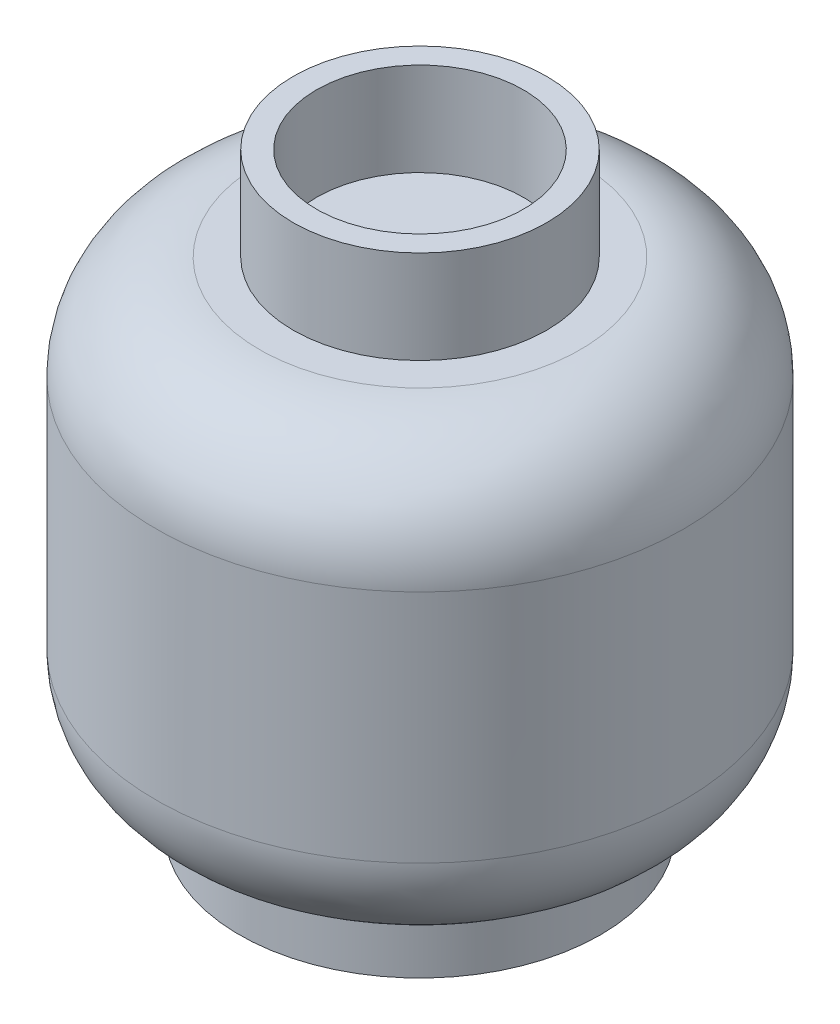
ISO-10303-21;
HEADER;
FILE_DESCRIPTION(('STEP AP214'),'2;1');
FILE_NAME('part.step','',(''),(''),'','','');
FILE_SCHEMA(('AUTOMOTIVE_DESIGN { 1 0 10303 214 1 1 1 1 }'));
ENDSEC;
DATA;
#1=APPLICATION_CONTEXT('core data for automotive mechanical design processes');
#2=APPLICATION_PROTOCOL_DEFINITION('international standard','automotive_design',2000,#1);
#3=PRODUCT_CONTEXT('',#1,'mechanical');
#4=PRODUCT('Part','Part','',(#3));
#5=PRODUCT_RELATED_PRODUCT_CATEGORY('part','',(#4));
#6=PRODUCT_DEFINITION_FORMATION('','',#4);
#7=PRODUCT_DEFINITION_CONTEXT('part definition',#1,'design');
#8=PRODUCT_DEFINITION('design','',#6,#7);
#9=PRODUCT_DEFINITION_SHAPE('','',#8);
#10=(LENGTH_UNIT() NAMED_UNIT(*) SI_UNIT(.MILLI.,.METRE.));
#11=(NAMED_UNIT(*) PLANE_ANGLE_UNIT() SI_UNIT($,.RADIAN.));
#12=(NAMED_UNIT(*) SI_UNIT($,.STERADIAN.) SOLID_ANGLE_UNIT());
#13=UNCERTAINTY_MEASURE_WITH_UNIT(LENGTH_MEASURE(1.E-05),#10,'distance_accuracy_value','');
#14=(GEOMETRIC_REPRESENTATION_CONTEXT(3) GLOBAL_UNCERTAINTY_ASSIGNED_CONTEXT((#13)) GLOBAL_UNIT_ASSIGNED_CONTEXT((#10,
#11,#12)) REPRESENTATION_CONTEXT('',''));
#15=CARTESIAN_POINT('',(0.,0.,0.));
#16=DIRECTION('',(0.,0.,1.));
#17=DIRECTION('',(1.,0.,0.));
#18=AXIS2_PLACEMENT_3D('',#15,#16,#17);
#19=CARTESIAN_POINT('',(0.,-5.7,0.));
#20=DIRECTION('',(0.,-1.,0.));
#21=DIRECTION('',(1.,0.,0.));
#22=AXIS2_PLACEMENT_3D('',#19,#20,#21);
#23=CYLINDRICAL_SURFACE('',#22,5.1);
#24=CARTESIAN_POINT('',(0.,-2.63819496743612,0.));
#25=DIRECTION('',(0.,-1.,0.));
#26=DIRECTION('',(1.,0.,0.));
#27=AXIS2_PLACEMENT_3D('',#24,#25,#26);
#28=CIRCLE('',#27,5.1);
#29=CARTESIAN_POINT('',(5.1,-2.63819496743612,0.));
#30=VERTEX_POINT('',#29);
#31=EDGE_CURVE('E43',#30,#30,#28,.F.);
#32=ORIENTED_EDGE('',*,*,#31,.T.);
#33=EDGE_LOOP('',(#32));
#34=FACE_BOUND('',#33,.T.);
#35=CARTESIAN_POINT('',(0.,1.9,0.));
#36=DIRECTION('',(0.,1.,0.));
#37=DIRECTION('',(-1.,0.,0.));
#38=AXIS2_PLACEMENT_3D('',#35,#36,#37);
#39=CIRCLE('',#38,5.1);
#40=CARTESIAN_POINT('',(-5.1,1.9,0.));
#41=VERTEX_POINT('',#40);
#42=EDGE_CURVE('E47',#41,#41,#39,.F.);
#43=ORIENTED_EDGE('',*,*,#42,.T.);
#44=EDGE_LOOP('',(#43));
#45=FACE_BOUND('',#44,.T.);
#46=ADVANCED_FACE('F36',(#34,#45),#23,.T.);
#47=CARTESIAN_POINT('',(2.45,3.9,0.));
#48=DIRECTION('',(0.,1.,0.));
#49=DIRECTION('',(-1.,0.,0.));
#50=AXIS2_PLACEMENT_3D('',#47,#48,#49);
#51=PLANE('',#50);
#52=CARTESIAN_POINT('',(0.,3.9,0.));
#53=DIRECTION('',(0.,1.,0.));
#54=DIRECTION('',(-1.,0.,0.));
#55=AXIS2_PLACEMENT_3D('',#52,#53,#54);
#56=CIRCLE('',#55,3.1);
#57=CARTESIAN_POINT('',(-3.1,3.9,0.));
#58=VERTEX_POINT('',#57);
#59=EDGE_CURVE('E10',#58,#58,#56,.T.);
#60=ORIENTED_EDGE('',*,*,#59,.T.);
#61=EDGE_LOOP('',(#60));
#62=FACE_BOUND('',#61,.T.);
#63=CARTESIAN_POINT('',(0.,3.9,0.));
#64=DIRECTION('',(0.,-1.,0.));
#65=DIRECTION('',(1.,0.,0.));
#66=AXIS2_PLACEMENT_3D('',#63,#64,#65);
#67=CIRCLE('',#66,2.45);
#68=CARTESIAN_POINT('',(2.45,3.9,0.));
#69=VERTEX_POINT('',#68);
#70=EDGE_CURVE('E51',#69,#69,#67,.T.);
#71=ORIENTED_EDGE('',*,*,#70,.T.);
#72=EDGE_LOOP('',(#71));
#73=FACE_BOUND('',#72,.T.);
#74=ADVANCED_FACE('F97',(#62,#73),#51,.T.);
#75=CARTESIAN_POINT('',(0.,-5.7,0.));
#76=DIRECTION('',(0.,-1.,0.));
#77=DIRECTION('',(1.,0.,0.));
#78=AXIS2_PLACEMENT_3D('',#75,#76,#77);
#79=CYLINDRICAL_SURFACE('',#78,2.45);
#80=CARTESIAN_POINT('',(0.,5.7,0.));
#81=DIRECTION('',(0.,-1.,0.));
#82=DIRECTION('',(1.,0.,0.));
#83=AXIS2_PLACEMENT_3D('',#80,#81,#82);
#84=CIRCLE('',#83,2.45);
#85=CARTESIAN_POINT('',(2.45,5.7,0.));
#86=VERTEX_POINT('',#85);
#87=EDGE_CURVE('E56',#86,#86,#84,.T.);
#88=ORIENTED_EDGE('',*,*,#87,.T.);
#89=EDGE_LOOP('',(#88));
#90=FACE_BOUND('',#89,.T.);
#91=ORIENTED_EDGE('',*,*,#70,.F.);
#92=EDGE_LOOP('',(#91));
#93=FACE_BOUND('',#92,.T.);
#94=ADVANCED_FACE('F91',(#90,#93),#79,.T.);
#95=CARTESIAN_POINT('',(0.,5.7,0.));
#96=DIRECTION('',(0.,1.,0.));
#97=DIRECTION('',(-1.,0.,0.));
#98=AXIS2_PLACEMENT_3D('',#95,#96,#97);
#99=PLANE('',#98);
#100=CARTESIAN_POINT('',(0.,5.7,0.));
#101=DIRECTION('',(0.,1.,0.));
#102=DIRECTION('',(-1.,0.,0.));
#103=AXIS2_PLACEMENT_3D('',#100,#101,#102);
#104=CIRCLE('',#103,2.);
#105=CARTESIAN_POINT('',(-2.,5.7,0.));
#106=VERTEX_POINT('',#105);
#107=EDGE_CURVE('E72',#106,#106,#104,.T.);
#108=ORIENTED_EDGE('',*,*,#107,.F.);
#109=EDGE_LOOP('',(#108));
#110=FACE_BOUND('',#109,.T.);
#111=ORIENTED_EDGE('',*,*,#87,.F.);
#112=EDGE_LOOP('',(#111));
#113=FACE_BOUND('',#112,.T.);
#114=ADVANCED_FACE('F87',(#110,#113),#99,.T.);
#115=CARTESIAN_POINT('',(3.48900001826096,-5.7,0.));
#116=DIRECTION('',(0.,-1.,0.));
#117=DIRECTION('',(1.,0.,0.));
#118=AXIS2_PLACEMENT_3D('',#115,#116,#117);
#119=PLANE('',#118);
#120=CARTESIAN_POINT('',(0.,-5.7,0.));
#121=DIRECTION('',(0.,-1.,0.));
#122=DIRECTION('',(1.,0.,0.));
#123=AXIS2_PLACEMENT_3D('',#120,#121,#122);
#124=CIRCLE('',#123,2.5);
#125=CARTESIAN_POINT('',(2.5,-5.7,0.));
#126=VERTEX_POINT('',#125);
#127=EDGE_CURVE('E66',#126,#126,#124,.T.);
#128=ORIENTED_EDGE('',*,*,#127,.F.);
#129=EDGE_LOOP('',(#128));
#130=FACE_BOUND('',#129,.T.);
#131=CARTESIAN_POINT('',(0.,-5.7,0.));
#132=DIRECTION('',(0.,-1.,0.));
#133=DIRECTION('',(1.,0.,0.));
#134=AXIS2_PLACEMENT_3D('',#131,#132,#133);
#135=CIRCLE('',#134,3.48900001826096);
#136=CARTESIAN_POINT('',(3.48900001826096,-5.7,0.));
#137=VERTEX_POINT('',#136);
#138=EDGE_CURVE('E59',#137,#137,#135,.T.);
#139=ORIENTED_EDGE('',*,*,#138,.T.);
#140=EDGE_LOOP('',(#139));
#141=FACE_BOUND('',#140,.T.);
#142=ADVANCED_FACE('F90',(#130,#141),#119,.T.);
#143=CARTESIAN_POINT('',(0.,-5.7,0.));
#144=DIRECTION('',(0.,-1.,0.));
#145=DIRECTION('',(1.,0.,0.));
#146=AXIS2_PLACEMENT_3D('',#143,#144,#145);
#147=CYLINDRICAL_SURFACE('',#146,3.48900001826096);
#148=CARTESIAN_POINT('',(0.,-4.6,0.));
#149=DIRECTION('',(0.,-1.,0.));
#150=DIRECTION('',(1.,0.,0.));
#151=AXIS2_PLACEMENT_3D('',#148,#149,#150);
#152=CIRCLE('',#151,3.48900001826096);
#153=CARTESIAN_POINT('',(3.48900001826096,-4.6,0.));
#154=VERTEX_POINT('',#153);
#155=EDGE_CURVE('E62',#154,#154,#152,.T.);
#156=ORIENTED_EDGE('',*,*,#155,.T.);
#157=EDGE_LOOP('',(#156));
#158=FACE_BOUND('',#157,.T.);
#159=ORIENTED_EDGE('',*,*,#138,.F.);
#160=EDGE_LOOP('',(#159));
#161=FACE_BOUND('',#160,.T.);
#162=ADVANCED_FACE('F109',(#158,#161),#147,.T.);
#163=CARTESIAN_POINT('',(0.,-2.63819496743612,0.));
#164=DIRECTION('',(0.,-1.,0.));
#165=DIRECTION('',(1.,0.,0.));
#166=AXIS2_PLACEMENT_3D('',#163,#164,#165);
#167=TOROIDAL_SURFACE('',#166,3.1,2.);
#168=ORIENTED_EDGE('',*,*,#31,.F.);
#169=EDGE_LOOP('',(#168));
#170=FACE_BOUND('',#169,.T.);
#171=ORIENTED_EDGE('',*,*,#155,.F.);
#172=EDGE_LOOP('',(#171));
#173=FACE_BOUND('',#172,.T.);
#174=ADVANCED_FACE('F107',(#170,#173),#167,.T.);
#175=CARTESIAN_POINT('',(0.,1.9,0.));
#176=DIRECTION('',(0.,1.,0.));
#177=DIRECTION('',(-1.,0.,0.));
#178=AXIS2_PLACEMENT_3D('',#175,#176,#177);
#179=TOROIDAL_SURFACE('',#178,3.1,2.);
#180=ORIENTED_EDGE('',*,*,#59,.F.);
#181=EDGE_LOOP('',(#180));
#182=FACE_BOUND('',#181,.T.);
#183=ORIENTED_EDGE('',*,*,#42,.F.);
#184=EDGE_LOOP('',(#183));
#185=FACE_BOUND('',#184,.T.);
#186=ADVANCED_FACE('F38',(#182,#185),#179,.T.);
#187=CARTESIAN_POINT('',(0.,0.299999999999999,0.));
#188=DIRECTION('',(0.,-1.,0.));
#189=DIRECTION('',(1.,0.,0.));
#190=AXIS2_PLACEMENT_3D('',#187,#188,#189);
#191=CYLINDRICAL_SURFACE('',#190,2.5);
#192=CARTESIAN_POINT('',(0.,0.299999999999999,0.));
#193=DIRECTION('',(0.,-1.,0.));
#194=DIRECTION('',(1.,0.,0.));
#195=AXIS2_PLACEMENT_3D('',#192,#193,#194);
#196=CIRCLE('',#195,2.5);
#197=CARTESIAN_POINT('',(2.5,0.3,0.));
#198=VERTEX_POINT('',#197);
#199=EDGE_CURVE('E65',#198,#198,#196,.T.);
#200=ORIENTED_EDGE('',*,*,#199,.F.);
#201=EDGE_LOOP('',(#200));
#202=FACE_BOUND('',#201,.T.);
#203=ORIENTED_EDGE('',*,*,#127,.T.);
#204=EDGE_LOOP('',(#203));
#205=FACE_BOUND('',#204,.T.);
#206=ADVANCED_FACE('F115',(#202,#205),#191,.F.);
#207=CARTESIAN_POINT('',(0.,0.299999999999999,0.));
#208=DIRECTION('',(0.,-1.,0.));
#209=DIRECTION('',(1.,0.,0.));
#210=AXIS2_PLACEMENT_3D('',#207,#208,#209);
#211=PLANE('',#210);
#212=ORIENTED_EDGE('',*,*,#199,.T.);
#213=EDGE_LOOP('',(#212));
#214=FACE_BOUND('',#213,.T.);
#215=ADVANCED_FACE('F83',(#214),#211,.T.);
#216=CARTESIAN_POINT('',(0.,3.9,0.));
#217=DIRECTION('',(0.,1.,0.));
#218=DIRECTION('',(-1.,0.,0.));
#219=AXIS2_PLACEMENT_3D('',#216,#217,#218);
#220=CYLINDRICAL_SURFACE('',#219,2.);
#221=CARTESIAN_POINT('',(0.,3.9,0.));
#222=DIRECTION('',(0.,1.,0.));
#223=DIRECTION('',(-1.,0.,0.));
#224=AXIS2_PLACEMENT_3D('',#221,#222,#223);
#225=CIRCLE('',#224,2.);
#226=CARTESIAN_POINT('',(-2.,3.9,0.));
#227=VERTEX_POINT('',#226);
#228=EDGE_CURVE('E69',#227,#227,#225,.T.);
#229=ORIENTED_EDGE('',*,*,#228,.F.);
#230=EDGE_LOOP('',(#229));
#231=FACE_BOUND('',#230,.T.);
#232=ORIENTED_EDGE('',*,*,#107,.T.);
#233=EDGE_LOOP('',(#232));
#234=FACE_BOUND('',#233,.T.);
#235=ADVANCED_FACE('F80',(#231,#234),#220,.F.);
#236=CARTESIAN_POINT('',(0.,3.9,0.));
#237=DIRECTION('',(0.,1.,0.));
#238=DIRECTION('',(-1.,0.,0.));
#239=AXIS2_PLACEMENT_3D('',#236,#237,#238);
#240=PLANE('',#239);
#241=ORIENTED_EDGE('',*,*,#228,.T.);
#242=EDGE_LOOP('',(#241));
#243=FACE_BOUND('',#242,.T.);
#244=ADVANCED_FACE('F78',(#243),#240,.T.);
#245=CLOSED_SHELL('',(#46,#74,#94,#114,#142,#162,#174,#186,#206,#215,#235,#244));
#246=MANIFOLD_SOLID_BREP('B2',#245);
#247=ADVANCED_BREP_SHAPE_REPRESENTATION('',(#18,#246),#14);
#248=SHAPE_DEFINITION_REPRESENTATION(#9,#247);
ENDSEC;
END-ISO-10303-21;
